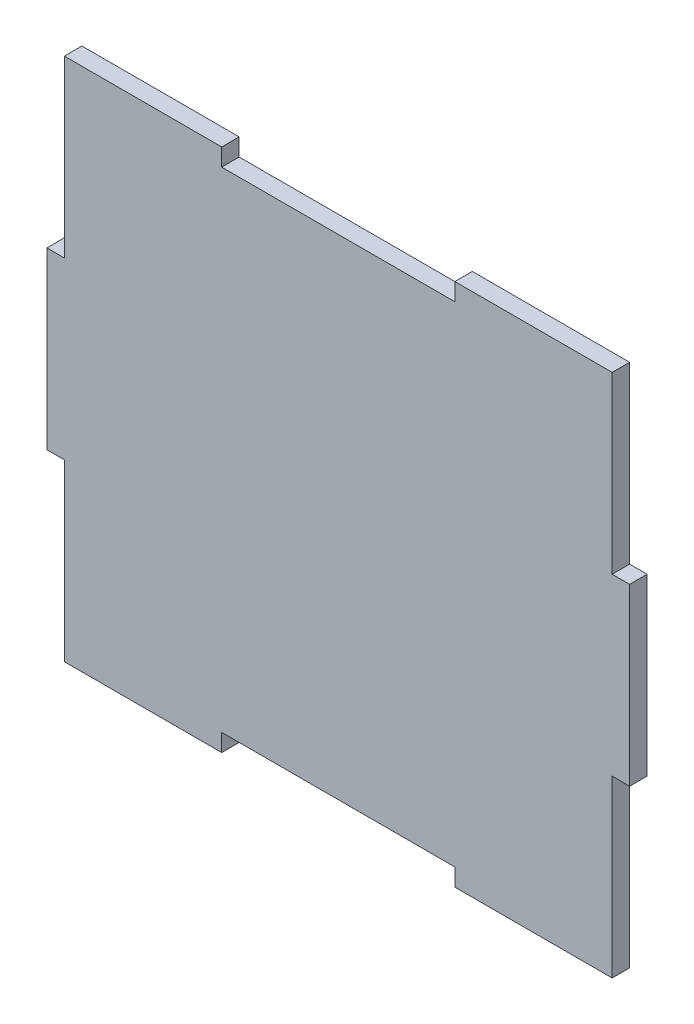
ISO-10303-21;
HEADER;
FILE_DESCRIPTION(('STEP AP214'),'2;1');
FILE_NAME('part.step','',(''),(''),'','','');
FILE_SCHEMA(('AUTOMOTIVE_DESIGN { 1 0 10303 214 1 1 1 1 }'));
ENDSEC;
DATA;
#1=APPLICATION_CONTEXT('core data for automotive mechanical design processes');
#2=APPLICATION_PROTOCOL_DEFINITION('international standard','automotive_design',2000,#1);
#3=PRODUCT_CONTEXT('',#1,'mechanical');
#4=PRODUCT('Part','Part','',(#3));
#5=PRODUCT_RELATED_PRODUCT_CATEGORY('part','',(#4));
#6=PRODUCT_DEFINITION_FORMATION('','',#4);
#7=PRODUCT_DEFINITION_CONTEXT('part definition',#1,'design');
#8=PRODUCT_DEFINITION('design','',#6,#7);
#9=PRODUCT_DEFINITION_SHAPE('','',#8);
#10=(LENGTH_UNIT() NAMED_UNIT(*) SI_UNIT(.MILLI.,.METRE.));
#11=(NAMED_UNIT(*) PLANE_ANGLE_UNIT() SI_UNIT($,.RADIAN.));
#12=(NAMED_UNIT(*) SI_UNIT($,.STERADIAN.) SOLID_ANGLE_UNIT());
#13=UNCERTAINTY_MEASURE_WITH_UNIT(LENGTH_MEASURE(1.E-05),#10,'distance_accuracy_value','');
#14=(GEOMETRIC_REPRESENTATION_CONTEXT(3) GLOBAL_UNCERTAINTY_ASSIGNED_CONTEXT((#13)) GLOBAL_UNIT_ASSIGNED_CONTEXT((#10,
#11,#12)) REPRESENTATION_CONTEXT('',''));
#15=CARTESIAN_POINT('',(0.,0.,0.));
#16=DIRECTION('',(0.,0.,1.));
#17=DIRECTION('',(1.,0.,0.));
#18=AXIS2_PLACEMENT_3D('',#15,#16,#17);
#19=CARTESIAN_POINT('',(-60.0385244305205,-64.3230403800475,3.));
#20=DIRECTION('',(0.,1.,0.));
#21=DIRECTION('',(0.,0.,1.));
#22=AXIS2_PLACEMENT_3D('',#19,#20,#21);
#23=PLANE('',#22);
#24=DIRECTION('',(1.,0.,0.));
#25=VECTOR('',#24,1.);
#26=CARTESIAN_POINT('',(-60.0385244305205,-64.3230403800475,0.));
#27=LINE('',#26,#25);
#28=CARTESIAN_POINT('',(-57.0385244305205,-64.3230403800475,0.));
#29=VERTEX_POINT('',#28);
#30=CARTESIAN_POINT('',(-30.0385244305205,-64.3230403800475,0.));
#31=VERTEX_POINT('',#30);
#32=EDGE_CURVE('E307',#29,#31,#27,.T.);
#33=ORIENTED_EDGE('',*,*,#32,.T.);
#34=DIRECTION('',(0.,0.,1.));
#35=VECTOR('',#34,1.);
#36=CARTESIAN_POINT('',(-30.0385244305205,-64.3230403800475,-0.00100000000000013));
#37=LINE('',#36,#35);
#38=CARTESIAN_POINT('',(-30.0385244305205,-64.3230403800475,3.));
#39=VERTEX_POINT('',#38);
#40=EDGE_CURVE('E227',#31,#39,#37,.T.);
#41=ORIENTED_EDGE('',*,*,#40,.T.);
#42=DIRECTION('',(1.,0.,0.));
#43=VECTOR('',#42,1.);
#44=CARTESIAN_POINT('',(-60.0385244305205,-64.3230403800475,3.));
#45=LINE('',#44,#43);
#46=CARTESIAN_POINT('',(-57.0385244305205,-64.3230403800475,3.));
#47=VERTEX_POINT('',#46);
#48=EDGE_CURVE('E298',#47,#39,#45,.T.);
#49=ORIENTED_EDGE('',*,*,#48,.F.);
#50=DIRECTION('',(0.,0.,1.));
#51=VECTOR('',#50,1.);
#52=CARTESIAN_POINT('',(-57.0385244305205,-64.3230403800475,-0.00100000000000013));
#53=LINE('',#52,#51);
#54=EDGE_CURVE('E245',#29,#47,#53,.T.);
#55=ORIENTED_EDGE('',*,*,#54,.F.);
#56=EDGE_LOOP('',(#33,#41,#49,#55));
#57=FACE_BOUND('',#56,.T.);
#58=ADVANCED_FACE('F33',(#57),#23,.F.);
#59=CARTESIAN_POINT('',(-60.0385244305205,25.6769596199525,3.));
#60=DIRECTION('',(0.,-1.,0.));
#61=DIRECTION('',(0.,0.,-1.));
#62=AXIS2_PLACEMENT_3D('',#59,#60,#61);
#63=PLANE('',#62);
#64=DIRECTION('',(-1.,0.,0.));
#65=VECTOR('',#64,1.);
#66=CARTESIAN_POINT('',(-60.0385244305205,25.6769596199525,0.));
#67=LINE('',#66,#65);
#68=CARTESIAN_POINT('',(-30.0385244305205,25.6769596199525,0.));
#69=VERTEX_POINT('',#68);
#70=CARTESIAN_POINT('',(-57.0385244305205,25.6769596199525,0.));
#71=VERTEX_POINT('',#70);
#72=EDGE_CURVE('E310',#69,#71,#67,.T.);
#73=ORIENTED_EDGE('',*,*,#72,.T.);
#74=DIRECTION('',(0.,0.,1.));
#75=VECTOR('',#74,1.);
#76=CARTESIAN_POINT('',(-57.0385244305205,25.6769596199525,-0.00100000000000013));
#77=LINE('',#76,#75);
#78=CARTESIAN_POINT('',(-57.0385244305205,25.6769596199525,3.));
#79=VERTEX_POINT('',#78);
#80=EDGE_CURVE('E260',#71,#79,#77,.T.);
#81=ORIENTED_EDGE('',*,*,#80,.T.);
#82=DIRECTION('',(-1.,0.,0.));
#83=VECTOR('',#82,1.);
#84=CARTESIAN_POINT('',(-60.0385244305205,25.6769596199525,3.));
#85=LINE('',#84,#83);
#86=CARTESIAN_POINT('',(-30.0385244305205,25.6769596199525,3.));
#87=VERTEX_POINT('',#86);
#88=EDGE_CURVE('E42',#87,#79,#85,.T.);
#89=ORIENTED_EDGE('',*,*,#88,.F.);
#90=DIRECTION('',(0.,0.,1.));
#91=VECTOR('',#90,1.);
#92=CARTESIAN_POINT('',(-30.0385244305205,25.6769596199525,-0.00100000000000013));
#93=LINE('',#92,#91);
#94=EDGE_CURVE('E282',#69,#87,#93,.T.);
#95=ORIENTED_EDGE('',*,*,#94,.F.);
#96=EDGE_LOOP('',(#73,#81,#89,#95));
#97=FACE_BOUND('',#96,.T.);
#98=ADVANCED_FACE('F388',(#97),#63,.F.);
#99=CARTESIAN_POINT('',(-60.0385244305205,25.6769596199525,3.));
#100=DIRECTION('',(1.,0.,0.));
#101=DIRECTION('',(0.,1.,0.));
#102=AXIS2_PLACEMENT_3D('',#99,#100,#101);
#103=PLANE('',#102);
#104=DIRECTION('',(0.,-1.,0.));
#105=VECTOR('',#104,1.);
#106=CARTESIAN_POINT('',(-60.0385244305205,25.6769596199525,0.));
#107=LINE('',#106,#105);
#108=CARTESIAN_POINT('',(-60.0385244305205,-4.3230403800475,0.));
#109=VERTEX_POINT('',#108);
#110=CARTESIAN_POINT('',(-60.0385244305205,-34.3230403800475,0.));
#111=VERTEX_POINT('',#110);
#112=EDGE_CURVE('E293',#109,#111,#107,.T.);
#113=ORIENTED_EDGE('',*,*,#112,.T.);
#114=DIRECTION('',(0.,0.,1.));
#115=VECTOR('',#114,1.);
#116=CARTESIAN_POINT('',(-60.0385244305205,-34.3230403800475,-0.00100000000000013));
#117=LINE('',#116,#115);
#118=CARTESIAN_POINT('',(-60.0385244305205,-34.3230403800475,3.));
#119=VERTEX_POINT('',#118);
#120=EDGE_CURVE('E246',#111,#119,#117,.T.);
#121=ORIENTED_EDGE('',*,*,#120,.T.);
#122=DIRECTION('',(0.,-1.,0.));
#123=VECTOR('',#122,1.);
#124=CARTESIAN_POINT('',(-60.0385244305205,25.6769596199525,3.));
#125=LINE('',#124,#123);
#126=CARTESIAN_POINT('',(-60.0385244305205,-4.32304038004751,3.));
#127=VERTEX_POINT('',#126);
#128=EDGE_CURVE('E294',#127,#119,#125,.T.);
#129=ORIENTED_EDGE('',*,*,#128,.F.);
#130=DIRECTION('',(0.,0.,1.));
#131=VECTOR('',#130,1.);
#132=CARTESIAN_POINT('',(-60.0385244305205,-4.32304038004751,-0.00100000000000013));
#133=LINE('',#132,#131);
#134=EDGE_CURVE('E259',#109,#127,#133,.T.);
#135=ORIENTED_EDGE('',*,*,#134,.F.);
#136=EDGE_LOOP('',(#113,#121,#129,#135));
#137=FACE_BOUND('',#136,.T.);
#138=ADVANCED_FACE('F35',(#137),#103,.F.);
#139=CARTESIAN_POINT('',(9.9614755694795,-64.3230403800475,0.));
#140=VERTEX_POINT('',#139);
#141=CARTESIAN_POINT('',(36.9614755694795,-64.3230403800475,0.));
#142=VERTEX_POINT('',#141);
#143=EDGE_CURVE('E306',#140,#142,#27,.T.);
#144=ORIENTED_EDGE('',*,*,#143,.T.);
#145=DIRECTION('',(0.,0.,1.));
#146=VECTOR('',#145,1.);
#147=CARTESIAN_POINT('',(36.9614755694795,-64.3230403800475,-0.00100000000000013));
#148=LINE('',#147,#146);
#149=CARTESIAN_POINT('',(36.9614755694795,-64.3230403800475,3.));
#150=VERTEX_POINT('',#149);
#151=EDGE_CURVE('E205',#142,#150,#148,.T.);
#152=ORIENTED_EDGE('',*,*,#151,.T.);
#153=CARTESIAN_POINT('',(9.9614755694795,-64.3230403800475,3.));
#154=VERTEX_POINT('',#153);
#155=EDGE_CURVE('E297',#154,#150,#45,.T.);
#156=ORIENTED_EDGE('',*,*,#155,.F.);
#157=DIRECTION('',(0.,0.,1.));
#158=VECTOR('',#157,1.);
#159=CARTESIAN_POINT('',(9.9614755694795,-64.3230403800475,-0.00100000000000013));
#160=LINE('',#159,#158);
#161=EDGE_CURVE('E233',#140,#154,#160,.T.);
#162=ORIENTED_EDGE('',*,*,#161,.F.);
#163=EDGE_LOOP('',(#144,#152,#156,#162));
#164=FACE_BOUND('',#163,.T.);
#165=ADVANCED_FACE('F346',(#164),#23,.F.);
#166=CARTESIAN_POINT('',(39.9614755694795,25.6769596199525,3.));
#167=DIRECTION('',(-1.,0.,0.));
#168=DIRECTION('',(0.,-1.,0.));
#169=AXIS2_PLACEMENT_3D('',#166,#167,#168);
#170=PLANE('',#169);
#171=DIRECTION('',(0.,1.,0.));
#172=VECTOR('',#171,1.);
#173=CARTESIAN_POINT('',(39.9614755694795,25.6769596199525,0.));
#174=LINE('',#173,#172);
#175=CARTESIAN_POINT('',(39.9614755694795,-34.3230403800475,0.));
#176=VERTEX_POINT('',#175);
#177=CARTESIAN_POINT('',(39.9614755694795,-4.3230403800475,0.));
#178=VERTEX_POINT('',#177);
#179=EDGE_CURVE('E309',#176,#178,#174,.T.);
#180=ORIENTED_EDGE('',*,*,#179,.T.);
#181=DIRECTION('',(0.,0.,1.));
#182=VECTOR('',#181,1.);
#183=CARTESIAN_POINT('',(39.9614755694795,-4.32304038004751,-0.00100000000000013));
#184=LINE('',#183,#182);
#185=CARTESIAN_POINT('',(39.9614755694795,-4.32304038004751,3.));
#186=VERTEX_POINT('',#185);
#187=EDGE_CURVE('E50',#178,#186,#184,.T.);
#188=ORIENTED_EDGE('',*,*,#187,.T.);
#189=DIRECTION('',(0.,1.,0.));
#190=VECTOR('',#189,1.);
#191=CARTESIAN_POINT('',(39.9614755694795,25.6769596199525,3.));
#192=LINE('',#191,#190);
#193=CARTESIAN_POINT('',(39.9614755694795,-34.3230403800475,3.));
#194=VERTEX_POINT('',#193);
#195=EDGE_CURVE('E301',#194,#186,#192,.T.);
#196=ORIENTED_EDGE('',*,*,#195,.F.);
#197=DIRECTION('',(0.,0.,1.));
#198=VECTOR('',#197,1.);
#199=CARTESIAN_POINT('',(39.9614755694795,-34.3230403800475,-0.00100000000000013));
#200=LINE('',#199,#198);
#201=EDGE_CURVE('E209',#176,#194,#200,.T.);
#202=ORIENTED_EDGE('',*,*,#201,.F.);
#203=EDGE_LOOP('',(#180,#188,#196,#202));
#204=FACE_BOUND('',#203,.T.);
#205=ADVANCED_FACE('F335',(#204),#170,.F.);
#206=CARTESIAN_POINT('',(36.9614755694795,25.6769596199525,3.));
#207=VERTEX_POINT('',#206);
#208=CARTESIAN_POINT('',(9.9614755694795,25.6769596199525,3.));
#209=VERTEX_POINT('',#208);
#210=EDGE_CURVE('E11',#207,#209,#85,.T.);
#211=ORIENTED_EDGE('',*,*,#210,.F.);
#212=DIRECTION('',(0.,0.,1.));
#213=VECTOR('',#212,1.);
#214=CARTESIAN_POINT('',(36.9614755694795,25.6769596199525,-0.00100000000000013));
#215=LINE('',#214,#213);
#216=CARTESIAN_POINT('',(36.9614755694795,25.6769596199525,0.));
#217=VERTEX_POINT('',#216);
#218=EDGE_CURVE('E187',#217,#207,#215,.T.);
#219=ORIENTED_EDGE('',*,*,#218,.F.);
#220=CARTESIAN_POINT('',(9.9614755694795,25.6769596199525,0.));
#221=VERTEX_POINT('',#220);
#222=EDGE_CURVE('E37',#217,#221,#67,.T.);
#223=ORIENTED_EDGE('',*,*,#222,.T.);
#224=DIRECTION('',(0.,0.,1.));
#225=VECTOR('',#224,1.);
#226=CARTESIAN_POINT('',(9.9614755694795,25.6769596199525,-0.00100000000000013));
#227=LINE('',#226,#225);
#228=EDGE_CURVE('E285',#221,#209,#227,.T.);
#229=ORIENTED_EDGE('',*,*,#228,.T.);
#230=EDGE_LOOP('',(#211,#219,#223,#229));
#231=FACE_BOUND('',#230,.T.);
#232=ADVANCED_FACE('F320',(#231),#63,.F.);
#233=CARTESIAN_POINT('',(0.,0.,3.));
#234=DIRECTION('',(0.,0.,1.));
#235=DIRECTION('',(1.,0.,0.));
#236=AXIS2_PLACEMENT_3D('',#233,#234,#235);
#237=PLANE('',#236);
#238=DIRECTION('',(0.,-1.,0.));
#239=VECTOR('',#238,1.);
#240=CARTESIAN_POINT('',(36.9614755694795,25.6769596199525,3.));
#241=LINE('',#240,#239);
#242=CARTESIAN_POINT('',(36.9614755694795,-4.32304038004751,3.));
#243=VERTEX_POINT('',#242);
#244=EDGE_CURVE('E177',#207,#243,#241,.T.);
#245=ORIENTED_EDGE('',*,*,#244,.F.);
#246=ORIENTED_EDGE('',*,*,#210,.T.);
#247=DIRECTION('',(0.,1.,0.));
#248=VECTOR('',#247,1.);
#249=CARTESIAN_POINT('',(9.9614755694795,25.6769596199525,3.));
#250=LINE('',#249,#248);
#251=CARTESIAN_POINT('',(9.9614755694795,22.6769596199525,3.));
#252=VERTEX_POINT('',#251);
#253=EDGE_CURVE('E278',#252,#209,#250,.T.);
#254=ORIENTED_EDGE('',*,*,#253,.F.);
#255=DIRECTION('',(1.,0.,0.));
#256=VECTOR('',#255,1.);
#257=CARTESIAN_POINT('',(-30.0385244305205,22.6769596199525,3.));
#258=LINE('',#257,#256);
#259=CARTESIAN_POINT('',(-30.0385244305205,22.6769596199525,3.));
#260=VERTEX_POINT('',#259);
#261=EDGE_CURVE('E275',#260,#252,#258,.T.);
#262=ORIENTED_EDGE('',*,*,#261,.F.);
#263=DIRECTION('',(0.,-1.,0.));
#264=VECTOR('',#263,1.);
#265=CARTESIAN_POINT('',(-30.0385244305205,25.6769596199525,3.));
#266=LINE('',#265,#264);
#267=EDGE_CURVE('E272',#87,#260,#266,.T.);
#268=ORIENTED_EDGE('',*,*,#267,.F.);
#269=ORIENTED_EDGE('',*,*,#88,.T.);
#270=DIRECTION('',(0.,1.,0.));
#271=VECTOR('',#270,1.);
#272=CARTESIAN_POINT('',(-57.0385244305205,25.6769596199525,3.));
#273=LINE('',#272,#271);
#274=CARTESIAN_POINT('',(-57.0385244305205,-4.32304038004751,3.));
#275=VERTEX_POINT('',#274);
#276=EDGE_CURVE('E257',#275,#79,#273,.T.);
#277=ORIENTED_EDGE('',*,*,#276,.F.);
#278=DIRECTION('',(1.,0.,0.));
#279=VECTOR('',#278,1.);
#280=CARTESIAN_POINT('',(-60.0385244305205,-4.32304038004751,3.));
#281=LINE('',#280,#279);
#282=EDGE_CURVE('E254',#127,#275,#281,.T.);
#283=ORIENTED_EDGE('',*,*,#282,.F.);
#284=ORIENTED_EDGE('',*,*,#128,.T.);
#285=DIRECTION('',(-1.,0.,0.));
#286=VECTOR('',#285,1.);
#287=CARTESIAN_POINT('',(-60.0385244305205,-34.3230403800475,3.));
#288=LINE('',#287,#286);
#289=CARTESIAN_POINT('',(-57.0385244305205,-34.3230403800475,3.));
#290=VERTEX_POINT('',#289);
#291=EDGE_CURVE('E243',#290,#119,#288,.T.);
#292=ORIENTED_EDGE('',*,*,#291,.F.);
#293=DIRECTION('',(0.,1.,0.));
#294=VECTOR('',#293,1.);
#295=CARTESIAN_POINT('',(-57.0385244305205,-34.3230403800475,3.));
#296=LINE('',#295,#294);
#297=EDGE_CURVE('E240',#47,#290,#296,.T.);
#298=ORIENTED_EDGE('',*,*,#297,.F.);
#299=ORIENTED_EDGE('',*,*,#48,.T.);
#300=DIRECTION('',(0.,-1.,0.));
#301=VECTOR('',#300,1.);
#302=CARTESIAN_POINT('',(-30.0385244305205,-64.3230403800475,3.));
#303=LINE('',#302,#301);
#304=CARTESIAN_POINT('',(-30.0385244305205,-61.3230403800475,3.));
#305=VERTEX_POINT('',#304);
#306=EDGE_CURVE('E219',#305,#39,#303,.T.);
#307=ORIENTED_EDGE('',*,*,#306,.F.);
#308=DIRECTION('',(-1.,0.,0.));
#309=VECTOR('',#308,1.);
#310=CARTESIAN_POINT('',(-30.0385244305205,-61.3230403800475,3.));
#311=LINE('',#310,#309);
#312=CARTESIAN_POINT('',(9.96147556947951,-61.3230403800475,3.));
#313=VERTEX_POINT('',#312);
#314=EDGE_CURVE('E224',#313,#305,#311,.T.);
#315=ORIENTED_EDGE('',*,*,#314,.F.);
#316=DIRECTION('',(0.,1.,0.));
#317=VECTOR('',#316,1.);
#318=CARTESIAN_POINT('',(9.9614755694795,-64.3230403800475,3.));
#319=LINE('',#318,#317);
#320=EDGE_CURVE('E221',#154,#313,#319,.T.);
#321=ORIENTED_EDGE('',*,*,#320,.F.);
#322=ORIENTED_EDGE('',*,*,#155,.T.);
#323=DIRECTION('',(0.,-1.,0.));
#324=VECTOR('',#323,1.);
#325=CARTESIAN_POINT('',(36.9614755694795,-64.3230403800475,3.));
#326=LINE('',#325,#324);
#327=CARTESIAN_POINT('',(36.9614755694795,-34.3230403800475,3.));
#328=VERTEX_POINT('',#327);
#329=EDGE_CURVE('E200',#328,#150,#326,.T.);
#330=ORIENTED_EDGE('',*,*,#329,.F.);
#331=DIRECTION('',(-1.,0.,0.));
#332=VECTOR('',#331,1.);
#333=CARTESIAN_POINT('',(36.9614755694795,-34.3230403800475,3.));
#334=LINE('',#333,#332);
#335=EDGE_CURVE('E202',#194,#328,#334,.T.);
#336=ORIENTED_EDGE('',*,*,#335,.F.);
#337=ORIENTED_EDGE('',*,*,#195,.T.);
#338=DIRECTION('',(1.,0.,0.));
#339=VECTOR('',#338,1.);
#340=CARTESIAN_POINT('',(36.9614755694795,-4.32304038004751,3.));
#341=LINE('',#340,#339);
#342=EDGE_CURVE('E179',#243,#186,#341,.T.);
#343=ORIENTED_EDGE('',*,*,#342,.F.);
#344=EDGE_LOOP('',(#245,#246,#254,#262,#268,#269,#277,#283,#284,#292,#298,#299,#307,#315,#321,
#322,#330,#336,#337,#343));
#345=FACE_BOUND('',#344,.T.);
#346=ADVANCED_FACE('F332',(#345),#237,.T.);
#347=CARTESIAN_POINT('',(0.,0.,0.));
#348=DIRECTION('',(0.,0.,1.));
#349=DIRECTION('',(1.,0.,0.));
#350=AXIS2_PLACEMENT_3D('',#347,#348,#349);
#351=PLANE('',#350);
#352=ORIENTED_EDGE('',*,*,#222,.F.);
#353=DIRECTION('',(0.,1.,0.));
#354=VECTOR('',#353,1.);
#355=CARTESIAN_POINT('',(36.9614755694795,25.6769596199525,0.));
#356=LINE('',#355,#354);
#357=CARTESIAN_POINT('',(36.9614755694795,-4.32304038004751,0.));
#358=VERTEX_POINT('',#357);
#359=EDGE_CURVE('E174',#358,#217,#356,.T.);
#360=ORIENTED_EDGE('',*,*,#359,.F.);
#361=DIRECTION('',(-1.,0.,0.));
#362=VECTOR('',#361,1.);
#363=CARTESIAN_POINT('',(36.9614755694795,-4.32304038004751,0.));
#364=LINE('',#363,#362);
#365=EDGE_CURVE('E181',#178,#358,#364,.T.);
#366=ORIENTED_EDGE('',*,*,#365,.F.);
#367=ORIENTED_EDGE('',*,*,#179,.F.);
#368=DIRECTION('',(1.,0.,0.));
#369=VECTOR('',#368,1.);
#370=CARTESIAN_POINT('',(36.9614755694795,-34.3230403800475,0.));
#371=LINE('',#370,#369);
#372=CARTESIAN_POINT('',(36.9614755694795,-34.3230403800475,0.));
#373=VERTEX_POINT('',#372);
#374=EDGE_CURVE('E186',#373,#176,#371,.T.);
#375=ORIENTED_EDGE('',*,*,#374,.F.);
#376=DIRECTION('',(0.,1.,0.));
#377=VECTOR('',#376,1.);
#378=CARTESIAN_POINT('',(36.9614755694795,-64.3230403800475,0.));
#379=LINE('',#378,#377);
#380=EDGE_CURVE('E58',#142,#373,#379,.T.);
#381=ORIENTED_EDGE('',*,*,#380,.F.);
#382=ORIENTED_EDGE('',*,*,#143,.F.);
#383=DIRECTION('',(0.,-1.,0.));
#384=VECTOR('',#383,1.);
#385=CARTESIAN_POINT('',(9.9614755694795,-64.3230403800475,0.));
#386=LINE('',#385,#384);
#387=CARTESIAN_POINT('',(9.96147556947951,-61.3230403800475,0.));
#388=VERTEX_POINT('',#387);
#389=EDGE_CURVE('E208',#388,#140,#386,.T.);
#390=ORIENTED_EDGE('',*,*,#389,.F.);
#391=DIRECTION('',(1.,0.,0.));
#392=VECTOR('',#391,1.);
#393=CARTESIAN_POINT('',(-30.0385244305205,-61.3230403800475,0.));
#394=LINE('',#393,#392);
#395=CARTESIAN_POINT('',(-30.0385244305205,-61.3230403800475,0.));
#396=VERTEX_POINT('',#395);
#397=EDGE_CURVE('E214',#396,#388,#394,.T.);
#398=ORIENTED_EDGE('',*,*,#397,.F.);
#399=DIRECTION('',(0.,1.,0.));
#400=VECTOR('',#399,1.);
#401=CARTESIAN_POINT('',(-30.0385244305205,-64.3230403800475,0.));
#402=LINE('',#401,#400);
#403=EDGE_CURVE('E216',#31,#396,#402,.T.);
#404=ORIENTED_EDGE('',*,*,#403,.F.);
#405=ORIENTED_EDGE('',*,*,#32,.F.);
#406=DIRECTION('',(0.,-1.,0.));
#407=VECTOR('',#406,1.);
#408=CARTESIAN_POINT('',(-57.0385244305205,-34.3230403800475,0.));
#409=LINE('',#408,#407);
#410=CARTESIAN_POINT('',(-57.0385244305205,-34.3230403800475,0.));
#411=VERTEX_POINT('',#410);
#412=EDGE_CURVE('E230',#411,#29,#409,.T.);
#413=ORIENTED_EDGE('',*,*,#412,.F.);
#414=DIRECTION('',(1.,0.,0.));
#415=VECTOR('',#414,1.);
#416=CARTESIAN_POINT('',(-60.0385244305205,-34.3230403800475,0.));
#417=LINE('',#416,#415);
#418=EDGE_CURVE('E238',#111,#411,#417,.T.);
#419=ORIENTED_EDGE('',*,*,#418,.F.);
#420=ORIENTED_EDGE('',*,*,#112,.F.);
#421=DIRECTION('',(-1.,0.,0.));
#422=VECTOR('',#421,1.);
#423=CARTESIAN_POINT('',(-60.0385244305205,-4.32304038004751,0.));
#424=LINE('',#423,#422);
#425=CARTESIAN_POINT('',(-57.0385244305205,-4.32304038004751,0.));
#426=VERTEX_POINT('',#425);
#427=EDGE_CURVE('E263',#426,#109,#424,.T.);
#428=ORIENTED_EDGE('',*,*,#427,.F.);
#429=DIRECTION('',(0.,-1.,0.));
#430=VECTOR('',#429,1.);
#431=CARTESIAN_POINT('',(-57.0385244305205,25.6769596199525,0.));
#432=LINE('',#431,#430);
#433=EDGE_CURVE('E249',#71,#426,#432,.T.);
#434=ORIENTED_EDGE('',*,*,#433,.F.);
#435=ORIENTED_EDGE('',*,*,#72,.F.);
#436=DIRECTION('',(0.,1.,0.));
#437=VECTOR('',#436,1.);
#438=CARTESIAN_POINT('',(-30.0385244305205,25.6769596199525,0.));
#439=LINE('',#438,#437);
#440=CARTESIAN_POINT('',(-30.0385244305205,22.6769596199525,0.));
#441=VERTEX_POINT('',#440);
#442=EDGE_CURVE('E270',#441,#69,#439,.T.);
#443=ORIENTED_EDGE('',*,*,#442,.F.);
#444=DIRECTION('',(-1.,0.,0.));
#445=VECTOR('',#444,1.);
#446=CARTESIAN_POINT('',(-30.0385244305205,22.6769596199525,0.));
#447=LINE('',#446,#445);
#448=CARTESIAN_POINT('',(9.9614755694795,22.6769596199525,0.));
#449=VERTEX_POINT('',#448);
#450=EDGE_CURVE('E284',#449,#441,#447,.T.);
#451=ORIENTED_EDGE('',*,*,#450,.F.);
#452=DIRECTION('',(0.,-1.,0.));
#453=VECTOR('',#452,1.);
#454=CARTESIAN_POINT('',(9.9614755694795,25.6769596199525,0.));
#455=LINE('',#454,#453);
#456=EDGE_CURVE('E268',#221,#449,#455,.T.);
#457=ORIENTED_EDGE('',*,*,#456,.F.);
#458=EDGE_LOOP('',(#352,#360,#366,#367,#375,#381,#382,#390,#398,#404,#405,#413,#419,#420,#428,
#434,#435,#443,#451,#457));
#459=FACE_BOUND('',#458,.T.);
#460=ADVANCED_FACE('F190',(#459),#351,.F.);
#461=CARTESIAN_POINT('',(-30.0385244305205,25.6769596199525,-0.00100000000000013));
#462=DIRECTION('',(-1.,0.,0.));
#463=DIRECTION('',(0.,0.,1.));
#464=AXIS2_PLACEMENT_3D('',#461,#462,#463);
#465=PLANE('',#464);
#466=ORIENTED_EDGE('',*,*,#442,.T.);
#467=ORIENTED_EDGE('',*,*,#94,.T.);
#468=ORIENTED_EDGE('',*,*,#267,.T.);
#469=DIRECTION('',(0.,0.,1.));
#470=VECTOR('',#469,1.);
#471=CARTESIAN_POINT('',(-30.0385244305205,22.6769596199525,-0.00100000000000013));
#472=LINE('',#471,#470);
#473=EDGE_CURVE('E281',#441,#260,#472,.T.);
#474=ORIENTED_EDGE('',*,*,#473,.F.);
#475=EDGE_LOOP('',(#466,#467,#468,#474));
#476=FACE_BOUND('',#475,.T.);
#477=ADVANCED_FACE('F390',(#476),#465,.F.);
#478=CARTESIAN_POINT('',(9.9614755694795,25.6769596199525,-0.00100000000000013));
#479=DIRECTION('',(1.,0.,0.));
#480=DIRECTION('',(0.,0.,-1.));
#481=AXIS2_PLACEMENT_3D('',#478,#479,#480);
#482=PLANE('',#481);
#483=ORIENTED_EDGE('',*,*,#456,.T.);
#484=DIRECTION('',(0.,0.,1.));
#485=VECTOR('',#484,1.);
#486=CARTESIAN_POINT('',(9.9614755694795,22.6769596199525,-0.00100000000000013));
#487=LINE('',#486,#485);
#488=EDGE_CURVE('E288',#449,#252,#487,.T.);
#489=ORIENTED_EDGE('',*,*,#488,.T.);
#490=ORIENTED_EDGE('',*,*,#253,.T.);
#491=ORIENTED_EDGE('',*,*,#228,.F.);
#492=EDGE_LOOP('',(#483,#489,#490,#491));
#493=FACE_BOUND('',#492,.T.);
#494=ADVANCED_FACE('F322',(#493),#482,.F.);
#495=CARTESIAN_POINT('',(-30.0385244305205,22.6769596199525,-0.00100000000000013));
#496=DIRECTION('',(0.,-1.,0.));
#497=DIRECTION('',(0.,0.,-1.));
#498=AXIS2_PLACEMENT_3D('',#495,#496,#497);
#499=PLANE('',#498);
#500=ORIENTED_EDGE('',*,*,#450,.T.);
#501=ORIENTED_EDGE('',*,*,#473,.T.);
#502=ORIENTED_EDGE('',*,*,#261,.T.);
#503=ORIENTED_EDGE('',*,*,#488,.F.);
#504=EDGE_LOOP('',(#500,#501,#502,#503));
#505=FACE_BOUND('',#504,.T.);
#506=ADVANCED_FACE('F328',(#505),#499,.F.);
#507=CARTESIAN_POINT('',(-57.0385244305205,25.6769596199525,-0.00100000000000013));
#508=DIRECTION('',(1.,0.,0.));
#509=DIRECTION('',(0.,1.,0.));
#510=AXIS2_PLACEMENT_3D('',#507,#508,#509);
#511=PLANE('',#510);
#512=ORIENTED_EDGE('',*,*,#433,.T.);
#513=DIRECTION('',(0.,0.,1.));
#514=VECTOR('',#513,1.);
#515=CARTESIAN_POINT('',(-57.0385244305205,-4.32304038004751,-0.00100000000000013));
#516=LINE('',#515,#514);
#517=EDGE_CURVE('E264',#426,#275,#516,.T.);
#518=ORIENTED_EDGE('',*,*,#517,.T.);
#519=ORIENTED_EDGE('',*,*,#276,.T.);
#520=ORIENTED_EDGE('',*,*,#80,.F.);
#521=EDGE_LOOP('',(#512,#518,#519,#520));
#522=FACE_BOUND('',#521,.T.);
#523=ADVANCED_FACE('F386',(#522),#511,.F.);
#524=CARTESIAN_POINT('',(-60.0385244305205,-4.32304038004751,-0.00100000000000013));
#525=DIRECTION('',(0.,-1.,0.));
#526=DIRECTION('',(0.,0.,-1.));
#527=AXIS2_PLACEMENT_3D('',#524,#525,#526);
#528=PLANE('',#527);
#529=ORIENTED_EDGE('',*,*,#427,.T.);
#530=ORIENTED_EDGE('',*,*,#134,.T.);
#531=ORIENTED_EDGE('',*,*,#282,.T.);
#532=ORIENTED_EDGE('',*,*,#517,.F.);
#533=EDGE_LOOP('',(#529,#530,#531,#532));
#534=FACE_BOUND('',#533,.T.);
#535=ADVANCED_FACE('F380',(#534),#528,.F.);
#536=CARTESIAN_POINT('',(-60.0385244305205,-34.3230403800475,-0.00100000000000013));
#537=DIRECTION('',(0.,1.,0.));
#538=DIRECTION('',(0.,0.,1.));
#539=AXIS2_PLACEMENT_3D('',#536,#537,#538);
#540=PLANE('',#539);
#541=ORIENTED_EDGE('',*,*,#418,.T.);
#542=DIRECTION('',(0.,0.,1.));
#543=VECTOR('',#542,1.);
#544=CARTESIAN_POINT('',(-57.0385244305205,-34.3230403800475,-0.00100000000000013));
#545=LINE('',#544,#543);
#546=EDGE_CURVE('E250',#411,#290,#545,.T.);
#547=ORIENTED_EDGE('',*,*,#546,.T.);
#548=ORIENTED_EDGE('',*,*,#291,.T.);
#549=ORIENTED_EDGE('',*,*,#120,.F.);
#550=EDGE_LOOP('',(#541,#547,#548,#549));
#551=FACE_BOUND('',#550,.T.);
#552=ADVANCED_FACE('F456',(#551),#540,.F.);
#553=CARTESIAN_POINT('',(-57.0385244305205,-34.3230403800475,-0.00100000000000013));
#554=DIRECTION('',(1.,0.,0.));
#555=DIRECTION('',(0.,0.,-1.));
#556=AXIS2_PLACEMENT_3D('',#553,#554,#555);
#557=PLANE('',#556);
#558=ORIENTED_EDGE('',*,*,#412,.T.);
#559=ORIENTED_EDGE('',*,*,#54,.T.);
#560=ORIENTED_EDGE('',*,*,#297,.T.);
#561=ORIENTED_EDGE('',*,*,#546,.F.);
#562=EDGE_LOOP('',(#558,#559,#560,#561));
#563=FACE_BOUND('',#562,.T.);
#564=ADVANCED_FACE('F369',(#563),#557,.F.);
#565=CARTESIAN_POINT('',(-30.0385244305205,-64.3230403800475,-0.00100000000000013));
#566=DIRECTION('',(-1.,0.,0.));
#567=DIRECTION('',(0.,0.,1.));
#568=AXIS2_PLACEMENT_3D('',#565,#566,#567);
#569=PLANE('',#568);
#570=ORIENTED_EDGE('',*,*,#403,.T.);
#571=DIRECTION('',(0.,0.,1.));
#572=VECTOR('',#571,1.);
#573=CARTESIAN_POINT('',(-30.0385244305205,-61.3230403800475,-0.00100000000000013));
#574=LINE('',#573,#572);
#575=EDGE_CURVE('E228',#396,#305,#574,.T.);
#576=ORIENTED_EDGE('',*,*,#575,.T.);
#577=ORIENTED_EDGE('',*,*,#306,.T.);
#578=ORIENTED_EDGE('',*,*,#40,.F.);
#579=EDGE_LOOP('',(#570,#576,#577,#578));
#580=FACE_BOUND('',#579,.T.);
#581=ADVANCED_FACE('F361',(#580),#569,.F.);
#582=CARTESIAN_POINT('',(-30.0385244305205,-61.3230403800475,-0.00100000000000013));
#583=DIRECTION('',(0.,1.,0.));
#584=DIRECTION('',(0.,0.,1.));
#585=AXIS2_PLACEMENT_3D('',#582,#583,#584);
#586=PLANE('',#585);
#587=ORIENTED_EDGE('',*,*,#397,.T.);
#588=DIRECTION('',(0.,0.,1.));
#589=VECTOR('',#588,1.);
#590=CARTESIAN_POINT('',(9.96147556947951,-61.3230403800475,-0.00100000000000013));
#591=LINE('',#590,#589);
#592=EDGE_CURVE('E231',#388,#313,#591,.T.);
#593=ORIENTED_EDGE('',*,*,#592,.T.);
#594=ORIENTED_EDGE('',*,*,#314,.T.);
#595=ORIENTED_EDGE('',*,*,#575,.F.);
#596=EDGE_LOOP('',(#587,#593,#594,#595));
#597=FACE_BOUND('',#596,.T.);
#598=ADVANCED_FACE('F359',(#597),#586,.F.);
#599=CARTESIAN_POINT('',(9.9614755694795,-64.3230403800475,-0.00100000000000013));
#600=DIRECTION('',(1.,0.,0.));
#601=DIRECTION('',(0.,1.,0.));
#602=AXIS2_PLACEMENT_3D('',#599,#600,#601);
#603=PLANE('',#602);
#604=ORIENTED_EDGE('',*,*,#389,.T.);
#605=ORIENTED_EDGE('',*,*,#161,.T.);
#606=ORIENTED_EDGE('',*,*,#320,.T.);
#607=ORIENTED_EDGE('',*,*,#592,.F.);
#608=EDGE_LOOP('',(#604,#605,#606,#607));
#609=FACE_BOUND('',#608,.T.);
#610=ADVANCED_FACE('F353',(#609),#603,.F.);
#611=CARTESIAN_POINT('',(36.9614755694795,-64.3230403800475,-0.00100000000000013));
#612=DIRECTION('',(-1.,0.,0.));
#613=DIRECTION('',(0.,-1.,0.));
#614=AXIS2_PLACEMENT_3D('',#611,#612,#613);
#615=PLANE('',#614);
#616=ORIENTED_EDGE('',*,*,#380,.T.);
#617=DIRECTION('',(0.,0.,1.));
#618=VECTOR('',#617,1.);
#619=CARTESIAN_POINT('',(36.9614755694795,-34.3230403800475,-0.00100000000000013));
#620=LINE('',#619,#618);
#621=EDGE_CURVE('E206',#373,#328,#620,.T.);
#622=ORIENTED_EDGE('',*,*,#621,.T.);
#623=ORIENTED_EDGE('',*,*,#329,.T.);
#624=ORIENTED_EDGE('',*,*,#151,.F.);
#625=EDGE_LOOP('',(#616,#622,#623,#624));
#626=FACE_BOUND('',#625,.T.);
#627=ADVANCED_FACE('F342',(#626),#615,.F.);
#628=CARTESIAN_POINT('',(36.9614755694795,-34.3230403800475,-0.00100000000000013));
#629=DIRECTION('',(0.,1.,0.));
#630=DIRECTION('',(0.,0.,1.));
#631=AXIS2_PLACEMENT_3D('',#628,#629,#630);
#632=PLANE('',#631);
#633=ORIENTED_EDGE('',*,*,#374,.T.);
#634=ORIENTED_EDGE('',*,*,#201,.T.);
#635=ORIENTED_EDGE('',*,*,#335,.T.);
#636=ORIENTED_EDGE('',*,*,#621,.F.);
#637=EDGE_LOOP('',(#633,#634,#635,#636));
#638=FACE_BOUND('',#637,.T.);
#639=ADVANCED_FACE('F340',(#638),#632,.F.);
#640=CARTESIAN_POINT('',(36.9614755694795,25.6769596199525,-0.00100000000000013));
#641=DIRECTION('',(-1.,0.,0.));
#642=DIRECTION('',(0.,-1.,0.));
#643=AXIS2_PLACEMENT_3D('',#640,#641,#642);
#644=PLANE('',#643);
#645=ORIENTED_EDGE('',*,*,#359,.T.);
#646=ORIENTED_EDGE('',*,*,#218,.T.);
#647=ORIENTED_EDGE('',*,*,#244,.T.);
#648=DIRECTION('',(0.,0.,1.));
#649=VECTOR('',#648,1.);
#650=CARTESIAN_POINT('',(36.9614755694795,-4.32304038004751,-0.00100000000000013));
#651=LINE('',#650,#649);
#652=EDGE_CURVE('E171',#358,#243,#651,.T.);
#653=ORIENTED_EDGE('',*,*,#652,.F.);
#654=EDGE_LOOP('',(#645,#646,#647,#653));
#655=FACE_BOUND('',#654,.T.);
#656=ADVANCED_FACE('F172',(#655),#644,.F.);
#657=CARTESIAN_POINT('',(36.9614755694795,-4.32304038004751,-0.00100000000000013));
#658=DIRECTION('',(0.,-1.,0.));
#659=DIRECTION('',(0.,0.,-1.));
#660=AXIS2_PLACEMENT_3D('',#657,#658,#659);
#661=PLANE('',#660);
#662=ORIENTED_EDGE('',*,*,#365,.T.);
#663=ORIENTED_EDGE('',*,*,#652,.T.);
#664=ORIENTED_EDGE('',*,*,#342,.T.);
#665=ORIENTED_EDGE('',*,*,#187,.F.);
#666=EDGE_LOOP('',(#662,#663,#664,#665));
#667=FACE_BOUND('',#666,.T.);
#668=ADVANCED_FACE('F182',(#667),#661,.F.);
#669=CLOSED_SHELL('',(#58,#98,#138,#165,#205,#232,#346,#460,#477,#494,#506,#523,#535,#552,#564,
#581,#598,#610,#627,#639,#656,#668));
#670=MANIFOLD_SOLID_BREP('B2',#669);
#671=ADVANCED_BREP_SHAPE_REPRESENTATION('',(#18,#670),#14);
#672=SHAPE_DEFINITION_REPRESENTATION(#9,#671);
ENDSEC;
END-ISO-10303-21;
